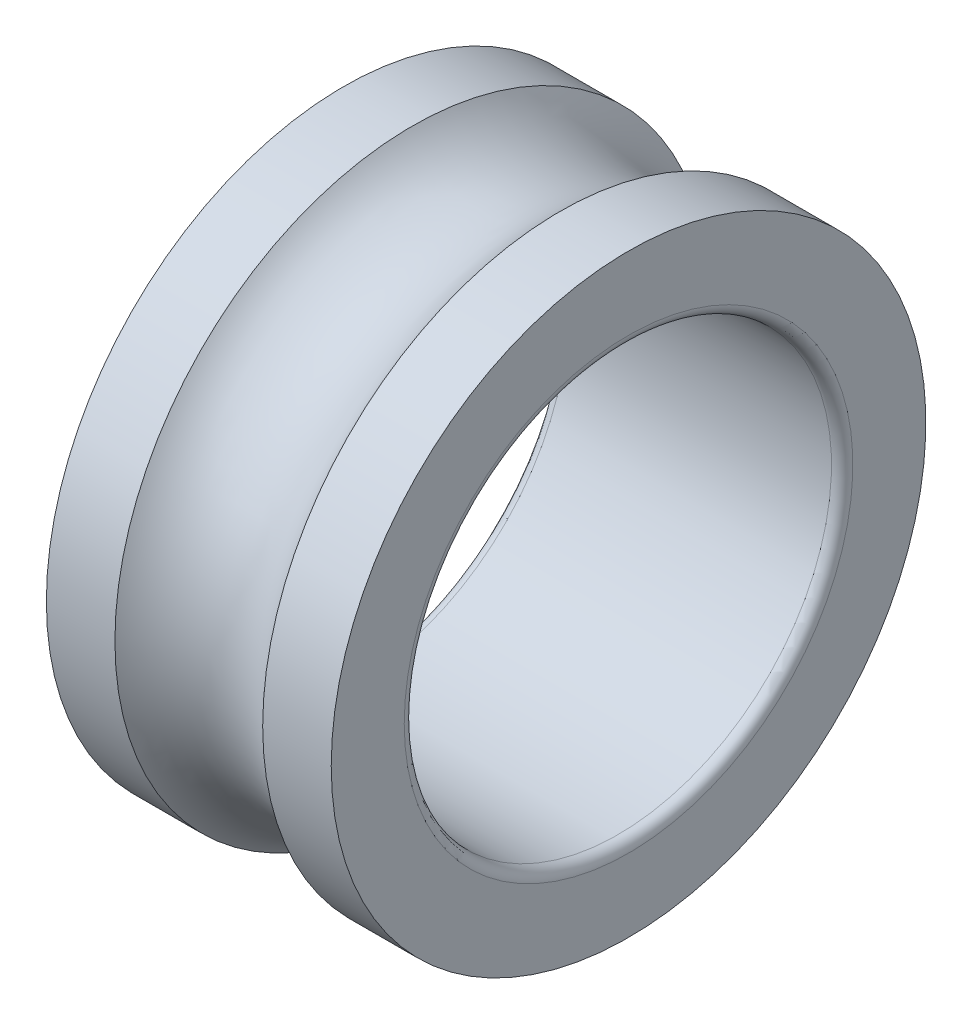
ISO-10303-21;
HEADER;
FILE_DESCRIPTION(('STEP AP214'),'2;1');
FILE_NAME('part.step','',(''),(''),'','','');
FILE_SCHEMA(('AUTOMOTIVE_DESIGN { 1 0 10303 214 1 1 1 1 }'));
ENDSEC;
DATA;
#1=APPLICATION_CONTEXT('core data for automotive mechanical design processes');
#2=APPLICATION_PROTOCOL_DEFINITION('international standard','automotive_design',2000,#1);
#3=PRODUCT_CONTEXT('',#1,'mechanical');
#4=PRODUCT('Part','Part','',(#3));
#5=PRODUCT_RELATED_PRODUCT_CATEGORY('part','',(#4));
#6=PRODUCT_DEFINITION_FORMATION('','',#4);
#7=PRODUCT_DEFINITION_CONTEXT('part definition',#1,'design');
#8=PRODUCT_DEFINITION('design','',#6,#7);
#9=PRODUCT_DEFINITION_SHAPE('','',#8);
#10=(LENGTH_UNIT() NAMED_UNIT(*) SI_UNIT(.MILLI.,.METRE.));
#11=(NAMED_UNIT(*) PLANE_ANGLE_UNIT() SI_UNIT($,.RADIAN.));
#12=(NAMED_UNIT(*) SI_UNIT($,.STERADIAN.) SOLID_ANGLE_UNIT());
#13=UNCERTAINTY_MEASURE_WITH_UNIT(LENGTH_MEASURE(1.E-05),#10,'distance_accuracy_value','');
#14=(GEOMETRIC_REPRESENTATION_CONTEXT(3) GLOBAL_UNCERTAINTY_ASSIGNED_CONTEXT((#13)) GLOBAL_UNIT_ASSIGNED_CONTEXT((#10,
#11,#12)) REPRESENTATION_CONTEXT('',''));
#15=CARTESIAN_POINT('',(0.,0.,0.));
#16=DIRECTION('',(0.,0.,1.));
#17=DIRECTION('',(1.,0.,0.));
#18=AXIS2_PLACEMENT_3D('',#15,#16,#17);
#19=CARTESIAN_POINT('',(0.,0.,0.));
#20=DIRECTION('',(-1.,0.,0.));
#21=DIRECTION('',(0.,0.,1.));
#22=AXIS2_PLACEMENT_3D('',#19,#20,#21);
#23=CYLINDRICAL_SURFACE('',#22,8.35);
#24=CARTESIAN_POINT('',(0.,0.,0.));
#25=DIRECTION('',(-1.,0.,0.));
#26=DIRECTION('',(0.,0.,1.));
#27=AXIS2_PLACEMENT_3D('',#24,#25,#26);
#28=CIRCLE('',#27,8.35);
#29=CARTESIAN_POINT('',(0.,0.,8.35));
#30=VERTEX_POINT('',#29);
#31=EDGE_CURVE('E10',#30,#30,#28,.T.);
#32=ORIENTED_EDGE('',*,*,#31,.F.);
#33=EDGE_LOOP('',(#32));
#34=FACE_BOUND('',#33,.T.);
#35=CARTESIAN_POINT('',(1.92503346747204,0.,0.));
#36=DIRECTION('',(-1.,0.,0.));
#37=DIRECTION('',(0.,0.,1.));
#38=AXIS2_PLACEMENT_3D('',#35,#36,#37);
#39=CIRCLE('',#38,8.35);
#40=CARTESIAN_POINT('',(1.92503346747204,0.,8.35));
#41=VERTEX_POINT('',#40);
#42=EDGE_CURVE('E43',#41,#41,#39,.T.);
#43=ORIENTED_EDGE('',*,*,#42,.T.);
#44=EDGE_LOOP('',(#43));
#45=FACE_BOUND('',#44,.T.);
#46=ADVANCED_FACE('F15',(#34,#45),#23,.T.);
#47=CARTESIAN_POINT('',(0.,8.35,0.));
#48=DIRECTION('',(1.,0.,0.));
#49=DIRECTION('',(0.,0.,-1.));
#50=AXIS2_PLACEMENT_3D('',#47,#48,#49);
#51=PLANE('',#50);
#52=CARTESIAN_POINT('',(0.,0.,0.));
#53=DIRECTION('',(-1.,0.,0.));
#54=DIRECTION('',(0.,0.,1.));
#55=AXIS2_PLACEMENT_3D('',#52,#53,#54);
#56=CIRCLE('',#55,6.3);
#57=CARTESIAN_POINT('',(0.,0.,6.3));
#58=VERTEX_POINT('',#57);
#59=EDGE_CURVE('E21',#58,#58,#56,.T.);
#60=ORIENTED_EDGE('',*,*,#59,.F.);
#61=EDGE_LOOP('',(#60));
#62=FACE_BOUND('',#61,.T.);
#63=ORIENTED_EDGE('',*,*,#31,.T.);
#64=EDGE_LOOP('',(#63));
#65=FACE_BOUND('',#64,.T.);
#66=ADVANCED_FACE('F61',(#62,#65),#51,.F.);
#67=CARTESIAN_POINT('',(0.3,0.,0.));
#68=DIRECTION('',(-1.,0.,0.));
#69=DIRECTION('',(0.,0.,1.));
#70=AXIS2_PLACEMENT_3D('',#67,#68,#69);
#71=TOROIDAL_SURFACE('',#70,6.3,0.3);
#72=CARTESIAN_POINT('',(0.3,0.,0.));
#73=DIRECTION('',(-1.,0.,0.));
#74=DIRECTION('',(0.,0.,1.));
#75=AXIS2_PLACEMENT_3D('',#72,#73,#74);
#76=CIRCLE('',#75,6.);
#77=CARTESIAN_POINT('',(0.3,0.,6.));
#78=VERTEX_POINT('',#77);
#79=EDGE_CURVE('E25',#78,#78,#76,.T.);
#80=ORIENTED_EDGE('',*,*,#79,.F.);
#81=EDGE_LOOP('',(#80));
#82=FACE_BOUND('',#81,.T.);
#83=ORIENTED_EDGE('',*,*,#59,.T.);
#84=EDGE_LOOP('',(#83));
#85=FACE_BOUND('',#84,.T.);
#86=ADVANCED_FACE('F66',(#82,#85),#71,.T.);
#87=CARTESIAN_POINT('',(0.,0.,0.));
#88=DIRECTION('',(-1.,0.,0.));
#89=DIRECTION('',(0.,0.,1.));
#90=AXIS2_PLACEMENT_3D('',#87,#88,#89);
#91=CYLINDRICAL_SURFACE('',#90,6.);
#92=CARTESIAN_POINT('',(7.7,0.,0.));
#93=DIRECTION('',(-1.,0.,0.));
#94=DIRECTION('',(0.,0.,1.));
#95=AXIS2_PLACEMENT_3D('',#92,#93,#94);
#96=CIRCLE('',#95,6.);
#97=CARTESIAN_POINT('',(7.7,0.,6.));
#98=VERTEX_POINT('',#97);
#99=EDGE_CURVE('E29',#98,#98,#96,.T.);
#100=ORIENTED_EDGE('',*,*,#99,.F.);
#101=EDGE_LOOP('',(#100));
#102=FACE_BOUND('',#101,.T.);
#103=ORIENTED_EDGE('',*,*,#79,.T.);
#104=EDGE_LOOP('',(#103));
#105=FACE_BOUND('',#104,.T.);
#106=ADVANCED_FACE('F71',(#102,#105),#91,.F.);
#107=CARTESIAN_POINT('',(7.7,0.,0.));
#108=DIRECTION('',(-1.,0.,0.));
#109=DIRECTION('',(0.,0.,1.));
#110=AXIS2_PLACEMENT_3D('',#107,#108,#109);
#111=TOROIDAL_SURFACE('',#110,6.3,0.3);
#112=CARTESIAN_POINT('',(8.,0.,0.));
#113=DIRECTION('',(-1.,0.,0.));
#114=DIRECTION('',(0.,0.,1.));
#115=AXIS2_PLACEMENT_3D('',#112,#113,#114);
#116=CIRCLE('',#115,6.3);
#117=CARTESIAN_POINT('',(8.,0.,6.3));
#118=VERTEX_POINT('',#117);
#119=EDGE_CURVE('E34',#118,#118,#116,.T.);
#120=ORIENTED_EDGE('',*,*,#119,.F.);
#121=EDGE_LOOP('',(#120));
#122=FACE_BOUND('',#121,.T.);
#123=ORIENTED_EDGE('',*,*,#99,.T.);
#124=EDGE_LOOP('',(#123));
#125=FACE_BOUND('',#124,.T.);
#126=ADVANCED_FACE('F77',(#122,#125),#111,.T.);
#127=CARTESIAN_POINT('',(8.,6.3,0.));
#128=DIRECTION('',(-1.,0.,0.));
#129=DIRECTION('',(0.,0.,1.));
#130=AXIS2_PLACEMENT_3D('',#127,#128,#129);
#131=PLANE('',#130);
#132=CARTESIAN_POINT('',(8.,0.,0.));
#133=DIRECTION('',(-1.,0.,0.));
#134=DIRECTION('',(0.,0.,1.));
#135=AXIS2_PLACEMENT_3D('',#132,#133,#134);
#136=CIRCLE('',#135,8.35);
#137=CARTESIAN_POINT('',(8.,0.,8.35));
#138=VERTEX_POINT('',#137);
#139=EDGE_CURVE('E37',#138,#138,#136,.T.);
#140=ORIENTED_EDGE('',*,*,#139,.F.);
#141=EDGE_LOOP('',(#140));
#142=FACE_BOUND('',#141,.T.);
#143=ORIENTED_EDGE('',*,*,#119,.T.);
#144=EDGE_LOOP('',(#143));
#145=FACE_BOUND('',#144,.T.);
#146=ADVANCED_FACE('F57',(#142,#145),#131,.F.);
#147=CARTESIAN_POINT('',(0.,0.,0.));
#148=DIRECTION('',(-1.,0.,0.));
#149=DIRECTION('',(0.,0.,1.));
#150=AXIS2_PLACEMENT_3D('',#147,#148,#149);
#151=CYLINDRICAL_SURFACE('',#150,8.35);
#152=CARTESIAN_POINT('',(6.07496653252796,0.,0.));
#153=DIRECTION('',(-1.,0.,0.));
#154=DIRECTION('',(0.,0.,1.));
#155=AXIS2_PLACEMENT_3D('',#152,#153,#154);
#156=CIRCLE('',#155,8.35);
#157=CARTESIAN_POINT('',(6.07496653252796,0.,8.35));
#158=VERTEX_POINT('',#157);
#159=EDGE_CURVE('E40',#158,#158,#156,.T.);
#160=ORIENTED_EDGE('',*,*,#159,.F.);
#161=EDGE_LOOP('',(#160));
#162=FACE_BOUND('',#161,.T.);
#163=ORIENTED_EDGE('',*,*,#139,.T.);
#164=EDGE_LOOP('',(#163));
#165=FACE_BOUND('',#164,.T.);
#166=ADVANCED_FACE('F50',(#162,#165),#151,.T.);
#167=CARTESIAN_POINT('',(4.,0.,0.));
#168=DIRECTION('',(-1.,0.,0.));
#169=DIRECTION('',(0.,0.,1.));
#170=AXIS2_PLACEMENT_3D('',#167,#168,#169);
#171=TOROIDAL_SURFACE('',#170,10.025,2.66666666666666);
#172=ORIENTED_EDGE('',*,*,#159,.T.);
#173=EDGE_LOOP('',(#172));
#174=FACE_BOUND('',#173,.T.);
#175=ORIENTED_EDGE('',*,*,#42,.F.);
#176=EDGE_LOOP('',(#175));
#177=FACE_BOUND('',#176,.T.);
#178=ADVANCED_FACE('F48',(#174,#177),#171,.F.);
#179=CLOSED_SHELL('',(#46,#66,#86,#106,#126,#146,#166,#178));
#180=MANIFOLD_SOLID_BREP('B1',#179);
#181=ADVANCED_BREP_SHAPE_REPRESENTATION('',(#18,#180),#14);
#182=SHAPE_DEFINITION_REPRESENTATION(#9,#181);
ENDSEC;
END-ISO-10303-21;
